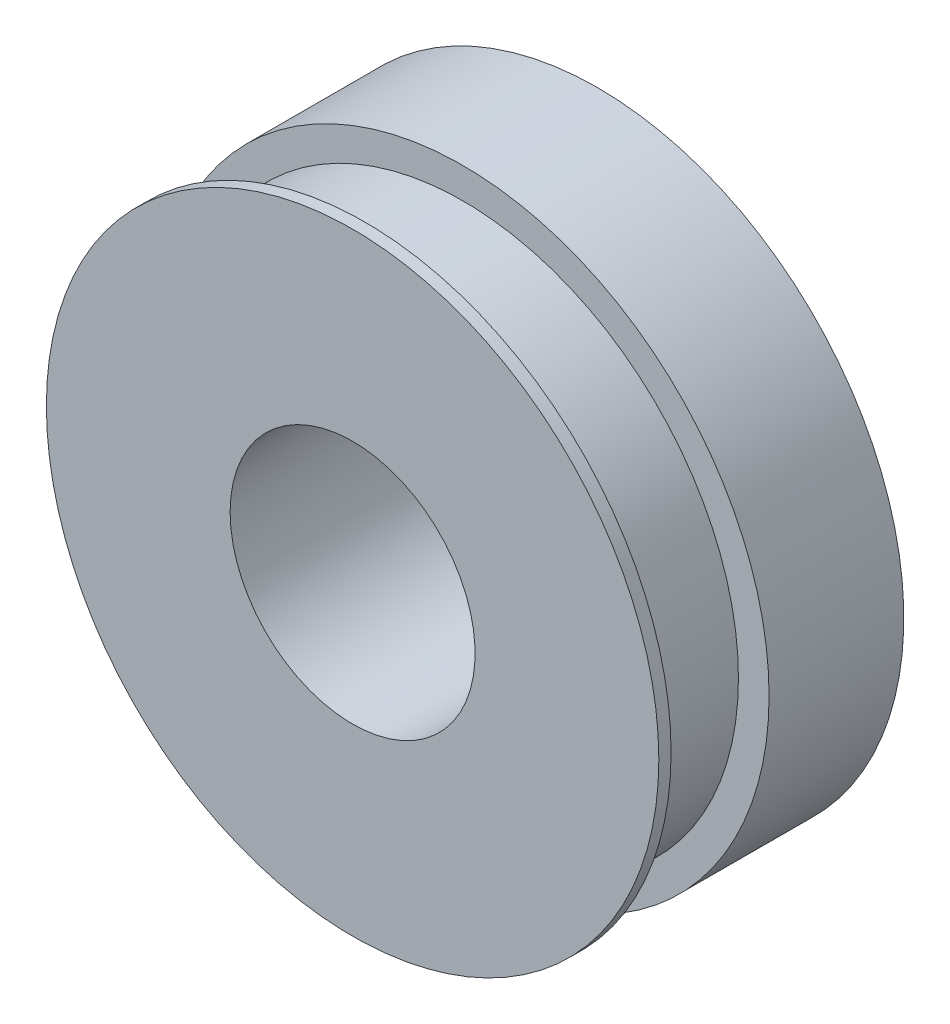
ISO-10303-21;
HEADER;
FILE_DESCRIPTION(('STEP AP214'),'2;1');
FILE_NAME('part.step','',(''),(''),'','','');
FILE_SCHEMA(('AUTOMOTIVE_DESIGN { 1 0 10303 214 1 1 1 1 }'));
ENDSEC;
DATA;
#1=APPLICATION_CONTEXT('core data for automotive mechanical design processes');
#2=APPLICATION_PROTOCOL_DEFINITION('international standard','automotive_design',2000,#1);
#3=PRODUCT_CONTEXT('',#1,'mechanical');
#4=PRODUCT('Part','Part','',(#3));
#5=PRODUCT_RELATED_PRODUCT_CATEGORY('part','',(#4));
#6=PRODUCT_DEFINITION_FORMATION('','',#4);
#7=PRODUCT_DEFINITION_CONTEXT('part definition',#1,'design');
#8=PRODUCT_DEFINITION('design','',#6,#7);
#9=PRODUCT_DEFINITION_SHAPE('','',#8);
#10=(LENGTH_UNIT() NAMED_UNIT(*) SI_UNIT(.MILLI.,.METRE.));
#11=(NAMED_UNIT(*) PLANE_ANGLE_UNIT() SI_UNIT($,.RADIAN.));
#12=(NAMED_UNIT(*) SI_UNIT($,.STERADIAN.) SOLID_ANGLE_UNIT());
#13=UNCERTAINTY_MEASURE_WITH_UNIT(LENGTH_MEASURE(1.E-05),#10,'distance_accuracy_value','');
#14=(GEOMETRIC_REPRESENTATION_CONTEXT(3) GLOBAL_UNCERTAINTY_ASSIGNED_CONTEXT((#13)) GLOBAL_UNIT_ASSIGNED_CONTEXT((#10,
#11,#12)) REPRESENTATION_CONTEXT('',''));
#15=CARTESIAN_POINT('',(0.,0.,0.));
#16=DIRECTION('',(0.,0.,1.));
#17=DIRECTION('',(1.,0.,0.));
#18=AXIS2_PLACEMENT_3D('',#15,#16,#17);
#19=CARTESIAN_POINT('',(0.,0.,20.));
#20=DIRECTION('',(0.,0.,-1.));
#21=DIRECTION('',(-1.,0.,0.));
#22=AXIS2_PLACEMENT_3D('',#19,#20,#21);
#23=CYLINDRICAL_SURFACE('',#22,25.);
#24=CARTESIAN_POINT('',(0.,0.,0.));
#25=DIRECTION('',(0.,0.,1.));
#26=DIRECTION('',(1.,0.,0.));
#27=AXIS2_PLACEMENT_3D('',#24,#25,#26);
#28=CIRCLE('',#27,25.);
#29=CARTESIAN_POINT('',(0.,-25.,0.));
#30=VERTEX_POINT('',#29);
#31=EDGE_CURVE('E38',#30,#30,#28,.T.);
#32=ORIENTED_EDGE('',*,*,#31,.T.);
#33=EDGE_LOOP('',(#32));
#34=FACE_BOUND('',#33,.T.);
#35=CARTESIAN_POINT('',(0.,0.,11.));
#36=DIRECTION('',(0.,0.,1.));
#37=DIRECTION('',(1.,0.,0.));
#38=AXIS2_PLACEMENT_3D('',#35,#36,#37);
#39=CIRCLE('',#38,25.);
#40=CARTESIAN_POINT('',(25.,0.,11.));
#41=VERTEX_POINT('',#40);
#42=EDGE_CURVE('E61',#41,#41,#39,.T.);
#43=ORIENTED_EDGE('',*,*,#42,.F.);
#44=EDGE_LOOP('',(#43));
#45=FACE_BOUND('',#44,.T.);
#46=ADVANCED_FACE('F34',(#34,#45),#23,.T.);
#47=CARTESIAN_POINT('',(0.,0.,19.));
#48=DIRECTION('',(0.,0.,1.));
#49=DIRECTION('',(1.,0.,0.));
#50=AXIS2_PLACEMENT_3D('',#47,#48,#49);
#51=CIRCLE('',#50,25.);
#52=CARTESIAN_POINT('',(25.,0.,19.));
#53=VERTEX_POINT('',#52);
#54=EDGE_CURVE('E64',#53,#53,#51,.T.);
#55=ORIENTED_EDGE('',*,*,#54,.T.);
#56=EDGE_LOOP('',(#55));
#57=FACE_BOUND('',#56,.T.);
#58=CARTESIAN_POINT('',(0.,0.,20.));
#59=DIRECTION('',(0.,0.,1.));
#60=DIRECTION('',(1.,0.,0.));
#61=AXIS2_PLACEMENT_3D('',#58,#59,#60);
#62=CIRCLE('',#61,25.);
#63=CARTESIAN_POINT('',(25.,0.,20.));
#64=VERTEX_POINT('',#63);
#65=EDGE_CURVE('E11',#64,#64,#62,.T.);
#66=ORIENTED_EDGE('',*,*,#65,.F.);
#67=EDGE_LOOP('',(#66));
#68=FACE_BOUND('',#67,.T.);
#69=ADVANCED_FACE('F36',(#57,#68),#23,.T.);
#70=CARTESIAN_POINT('',(0.,0.,20.));
#71=DIRECTION('',(0.,0.,1.));
#72=DIRECTION('',(1.,0.,0.));
#73=AXIS2_PLACEMENT_3D('',#70,#71,#72);
#74=PLANE('',#73);
#75=CARTESIAN_POINT('',(0.,0.,20.));
#76=DIRECTION('',(0.,0.,-1.));
#77=DIRECTION('',(-1.,0.,0.));
#78=AXIS2_PLACEMENT_3D('',#75,#76,#77);
#79=CIRCLE('',#78,10.);
#80=CARTESIAN_POINT('',(-10.,0.,20.));
#81=VERTEX_POINT('',#80);
#82=EDGE_CURVE('E55',#81,#81,#79,.T.);
#83=ORIENTED_EDGE('',*,*,#82,.T.);
#84=EDGE_LOOP('',(#83));
#85=FACE_BOUND('',#84,.T.);
#86=ORIENTED_EDGE('',*,*,#65,.T.);
#87=EDGE_LOOP('',(#86));
#88=FACE_BOUND('',#87,.T.);
#89=ADVANCED_FACE('F91',(#85,#88),#74,.T.);
#90=CARTESIAN_POINT('',(0.,0.,0.));
#91=DIRECTION('',(0.,0.,1.));
#92=DIRECTION('',(1.,0.,0.));
#93=AXIS2_PLACEMENT_3D('',#90,#91,#92);
#94=PLANE('',#93);
#95=CARTESIAN_POINT('',(0.,0.,0.));
#96=DIRECTION('',(0.,0.,-1.));
#97=DIRECTION('',(-1.,0.,0.));
#98=AXIS2_PLACEMENT_3D('',#95,#96,#97);
#99=CIRCLE('',#98,10.);
#100=CARTESIAN_POINT('',(-10.,0.,0.));
#101=VERTEX_POINT('',#100);
#102=EDGE_CURVE('E58',#101,#101,#99,.T.);
#103=ORIENTED_EDGE('',*,*,#102,.F.);
#104=EDGE_LOOP('',(#103));
#105=FACE_BOUND('',#104,.T.);
#106=ORIENTED_EDGE('',*,*,#31,.F.);
#107=CARTESIAN_POINT('',(0.,-20.,0.));
#108=DIRECTION('',(0.,0.,-1.));
#109=DIRECTION('',(-1.,0.,0.));
#110=AXIS2_PLACEMENT_3D('',#107,#108,#109);
#111=CIRCLE('',#110,5.);
#112=EDGE_CURVE('E48',#30,#30,#111,.T.);
#113=ORIENTED_EDGE('',*,*,#112,.F.);
#114=EDGE_LOOP('',(#106,#113));
#115=FACE_BOUND('',#114,.T.);
#116=ADVANCED_FACE('F46',(#105,#115),#94,.F.);
#117=CARTESIAN_POINT('',(0.,-20.,-10.));
#118=DIRECTION('',(0.,0.,1.));
#119=DIRECTION('',(1.,0.,0.));
#120=AXIS2_PLACEMENT_3D('',#117,#118,#119);
#121=CYLINDRICAL_SURFACE('',#120,5.);
#122=CARTESIAN_POINT('',(0.,-20.,-10.));
#123=DIRECTION('',(0.,0.,-1.));
#124=DIRECTION('',(-1.,0.,0.));
#125=AXIS2_PLACEMENT_3D('',#122,#123,#124);
#126=CIRCLE('',#125,5.);
#127=CARTESIAN_POINT('',(-5.,-20.,-10.));
#128=VERTEX_POINT('',#127);
#129=EDGE_CURVE('E50',#128,#128,#126,.T.);
#130=ORIENTED_EDGE('',*,*,#129,.F.);
#131=EDGE_LOOP('',(#130));
#132=FACE_BOUND('',#131,.T.);
#133=ORIENTED_EDGE('',*,*,#112,.T.);
#134=EDGE_LOOP('',(#133));
#135=FACE_BOUND('',#134,.T.);
#136=ADVANCED_FACE('F117',(#132,#135),#121,.T.);
#137=CARTESIAN_POINT('',(0.,-20.,-10.));
#138=DIRECTION('',(0.,0.,-1.));
#139=DIRECTION('',(-1.,0.,0.));
#140=AXIS2_PLACEMENT_3D('',#137,#138,#139);
#141=PLANE('',#140);
#142=ORIENTED_EDGE('',*,*,#129,.T.);
#143=EDGE_LOOP('',(#142));
#144=FACE_BOUND('',#143,.T.);
#145=ADVANCED_FACE('F113',(#144),#141,.T.);
#146=CARTESIAN_POINT('',(0.,0.,20.));
#147=DIRECTION('',(0.,0.,-1.));
#148=DIRECTION('',(-1.,0.,0.));
#149=AXIS2_PLACEMENT_3D('',#146,#147,#148);
#150=CYLINDRICAL_SURFACE('',#149,10.);
#151=ORIENTED_EDGE('',*,*,#82,.F.);
#152=EDGE_LOOP('',(#151));
#153=FACE_BOUND('',#152,.T.);
#154=ORIENTED_EDGE('',*,*,#102,.T.);
#155=EDGE_LOOP('',(#154));
#156=FACE_BOUND('',#155,.T.);
#157=ADVANCED_FACE('F83',(#153,#156),#150,.F.);
#158=CARTESIAN_POINT('',(0.,0.,11.));
#159=DIRECTION('',(0.,0.,1.));
#160=DIRECTION('',(1.,0.,0.));
#161=AXIS2_PLACEMENT_3D('',#158,#159,#160);
#162=PLANE('',#161);
#163=CARTESIAN_POINT('',(0.,0.,11.));
#164=DIRECTION('',(0.,0.,1.));
#165=DIRECTION('',(1.,0.,0.));
#166=AXIS2_PLACEMENT_3D('',#163,#164,#165);
#167=CIRCLE('',#166,22.5);
#168=CARTESIAN_POINT('',(22.5,0.,11.));
#169=VERTEX_POINT('',#168);
#170=EDGE_CURVE('E67',#169,#169,#167,.T.);
#171=ORIENTED_EDGE('',*,*,#170,.F.);
#172=EDGE_LOOP('',(#171));
#173=FACE_BOUND('',#172,.T.);
#174=ORIENTED_EDGE('',*,*,#42,.T.);
#175=EDGE_LOOP('',(#174));
#176=FACE_BOUND('',#175,.T.);
#177=ADVANCED_FACE('F79',(#173,#176),#162,.T.);
#178=CARTESIAN_POINT('',(0.,0.,19.));
#179=DIRECTION('',(0.,0.,1.));
#180=DIRECTION('',(1.,0.,0.));
#181=AXIS2_PLACEMENT_3D('',#178,#179,#180);
#182=PLANE('',#181);
#183=CARTESIAN_POINT('',(0.,0.,19.));
#184=DIRECTION('',(0.,0.,1.));
#185=DIRECTION('',(1.,0.,0.));
#186=AXIS2_PLACEMENT_3D('',#183,#184,#185);
#187=CIRCLE('',#186,22.5);
#188=CARTESIAN_POINT('',(22.5,0.,19.));
#189=VERTEX_POINT('',#188);
#190=EDGE_CURVE('E70',#189,#189,#187,.T.);
#191=ORIENTED_EDGE('',*,*,#190,.T.);
#192=EDGE_LOOP('',(#191));
#193=FACE_BOUND('',#192,.T.);
#194=ORIENTED_EDGE('',*,*,#54,.F.);
#195=EDGE_LOOP('',(#194));
#196=FACE_BOUND('',#195,.T.);
#197=ADVANCED_FACE('F82',(#193,#196),#182,.F.);
#198=CARTESIAN_POINT('',(0.,0.,11.));
#199=DIRECTION('',(0.,0.,1.));
#200=DIRECTION('',(1.,0.,0.));
#201=AXIS2_PLACEMENT_3D('',#198,#199,#200);
#202=CYLINDRICAL_SURFACE('',#201,22.5);
#203=ORIENTED_EDGE('',*,*,#170,.T.);
#204=EDGE_LOOP('',(#203));
#205=FACE_BOUND('',#204,.T.);
#206=ORIENTED_EDGE('',*,*,#190,.F.);
#207=EDGE_LOOP('',(#206));
#208=FACE_BOUND('',#207,.T.);
#209=ADVANCED_FACE('F76',(#205,#208),#202,.T.);
#210=CLOSED_SHELL('',(#46,#69,#89,#116,#136,#145,#157,#177,#197,#209));
#211=MANIFOLD_SOLID_BREP('B2',#210);
#212=ADVANCED_BREP_SHAPE_REPRESENTATION('',(#18,#211),#14);
#213=SHAPE_DEFINITION_REPRESENTATION(#9,#212);
ENDSEC;
END-ISO-10303-21;
